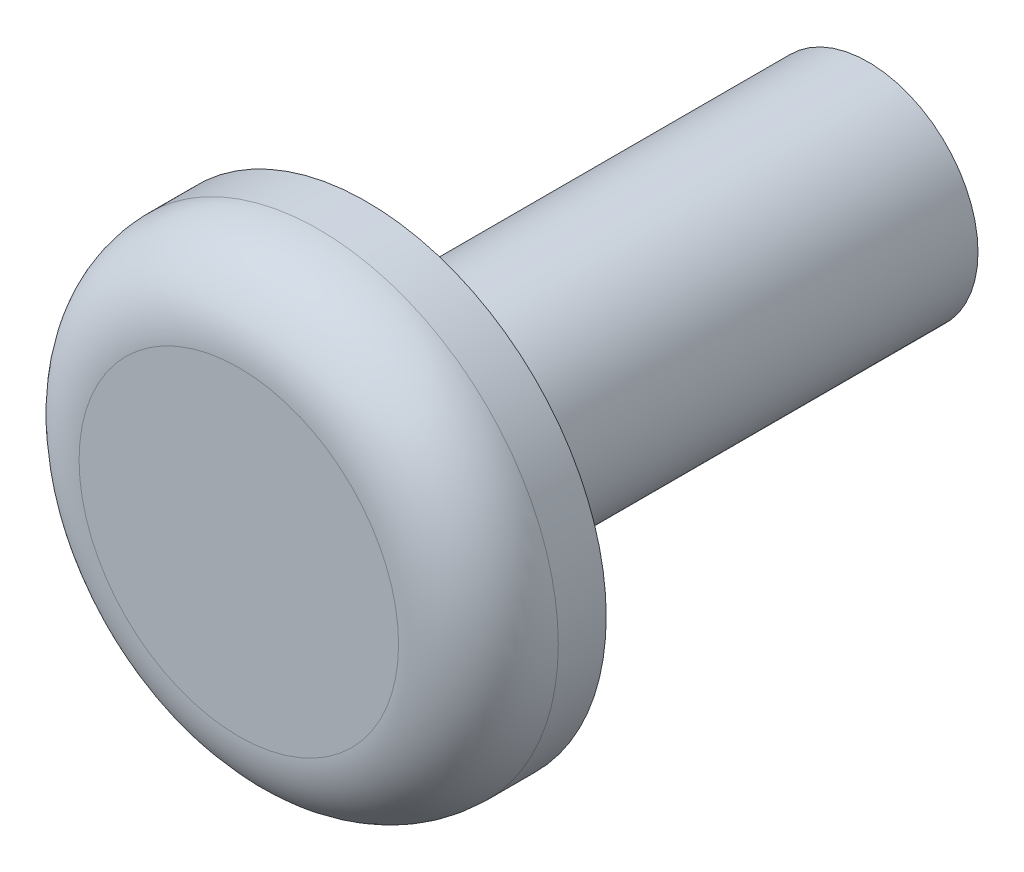
ISO-10303-21;
HEADER;
FILE_DESCRIPTION(('STEP AP214'),'2;1');
FILE_NAME('part.step','',(''),(''),'','','');
FILE_SCHEMA(('AUTOMOTIVE_DESIGN { 1 0 10303 214 1 1 1 1 }'));
ENDSEC;
DATA;
#1=APPLICATION_CONTEXT('core data for automotive mechanical design processes');
#2=APPLICATION_PROTOCOL_DEFINITION('international standard','automotive_design',2000,#1);
#3=PRODUCT_CONTEXT('',#1,'mechanical');
#4=PRODUCT('Part','Part','',(#3));
#5=PRODUCT_RELATED_PRODUCT_CATEGORY('part','',(#4));
#6=PRODUCT_DEFINITION_FORMATION('','',#4);
#7=PRODUCT_DEFINITION_CONTEXT('part definition',#1,'design');
#8=PRODUCT_DEFINITION('design','',#6,#7);
#9=PRODUCT_DEFINITION_SHAPE('','',#8);
#10=(LENGTH_UNIT() NAMED_UNIT(*) SI_UNIT(.MILLI.,.METRE.));
#11=(NAMED_UNIT(*) PLANE_ANGLE_UNIT() SI_UNIT($,.RADIAN.));
#12=(NAMED_UNIT(*) SI_UNIT($,.STERADIAN.) SOLID_ANGLE_UNIT());
#13=UNCERTAINTY_MEASURE_WITH_UNIT(LENGTH_MEASURE(1.E-05),#10,'distance_accuracy_value','');
#14=(GEOMETRIC_REPRESENTATION_CONTEXT(3) GLOBAL_UNCERTAINTY_ASSIGNED_CONTEXT((#13)) GLOBAL_UNIT_ASSIGNED_CONTEXT((#10,
#11,#12)) REPRESENTATION_CONTEXT('',''));
#15=CARTESIAN_POINT('',(0.,0.,0.));
#16=DIRECTION('',(0.,0.,1.));
#17=DIRECTION('',(1.,0.,0.));
#18=AXIS2_PLACEMENT_3D('',#15,#16,#17);
#19=CARTESIAN_POINT('',(0.,0.,15.7));
#20=DIRECTION('',(0.,0.,-1.));
#21=DIRECTION('',(-1.,0.,0.));
#22=AXIS2_PLACEMENT_3D('',#19,#20,#21);
#23=CYLINDRICAL_SURFACE('',#22,3.4375);
#24=CARTESIAN_POINT('',(0.,0.,15.7));
#25=DIRECTION('',(0.,0.,1.));
#26=DIRECTION('',(1.,0.,0.));
#27=AXIS2_PLACEMENT_3D('',#24,#25,#26);
#28=CIRCLE('',#27,3.4375);
#29=CARTESIAN_POINT('',(3.4375,0.,15.7));
#30=VERTEX_POINT('',#29);
#31=EDGE_CURVE('E69',#30,#30,#28,.T.);
#32=ORIENTED_EDGE('',*,*,#31,.F.);
#33=EDGE_LOOP('',(#32));
#34=FACE_BOUND('',#33,.T.);
#35=CARTESIAN_POINT('',(0.,0.,0.));
#36=DIRECTION('',(0.,0.,1.));
#37=DIRECTION('',(1.,0.,0.));
#38=AXIS2_PLACEMENT_3D('',#35,#36,#37);
#39=CIRCLE('',#38,3.4375);
#40=CARTESIAN_POINT('',(3.4375,0.,0.));
#41=VERTEX_POINT('',#40);
#42=EDGE_CURVE('E70',#41,#41,#39,.T.);
#43=ORIENTED_EDGE('',*,*,#42,.T.);
#44=EDGE_LOOP('',(#43));
#45=FACE_BOUND('',#44,.T.);
#46=ADVANCED_FACE('F45',(#34,#45),#23,.T.);
#47=CARTESIAN_POINT('',(0.,0.,0.));
#48=DIRECTION('',(0.,0.,1.));
#49=DIRECTION('',(1.,0.,0.));
#50=AXIS2_PLACEMENT_3D('',#47,#48,#49);
#51=PLANE('',#50);
#52=CARTESIAN_POINT('',(0.,0.,0.));
#53=DIRECTION('',(0.,0.,1.));
#54=DIRECTION('',(1.,0.,0.));
#55=AXIS2_PLACEMENT_3D('',#52,#53,#54);
#56=CIRCLE('',#55,1.7);
#57=CARTESIAN_POINT('',(1.7,0.,0.));
#58=VERTEX_POINT('',#57);
#59=EDGE_CURVE('E58',#58,#58,#56,.T.);
#60=ORIENTED_EDGE('',*,*,#59,.T.);
#61=EDGE_LOOP('',(#60));
#62=FACE_BOUND('',#61,.T.);
#63=ORIENTED_EDGE('',*,*,#42,.F.);
#64=EDGE_LOOP('',(#63));
#65=FACE_BOUND('',#64,.T.);
#66=ADVANCED_FACE('F106',(#62,#65),#51,.F.);
#67=CARTESIAN_POINT('',(0.,0.,19.7));
#68=DIRECTION('',(0.,0.,-1.));
#69=DIRECTION('',(-1.,0.,0.));
#70=AXIS2_PLACEMENT_3D('',#67,#68,#69);
#71=CYLINDRICAL_SURFACE('',#70,7.5);
#72=CARTESIAN_POINT('',(0.,0.,17.2));
#73=DIRECTION('',(0.,0.,1.));
#74=DIRECTION('',(1.,0.,0.));
#75=AXIS2_PLACEMENT_3D('',#72,#73,#74);
#76=CIRCLE('',#75,7.5);
#77=CARTESIAN_POINT('',(7.5,0.,17.2));
#78=VERTEX_POINT('',#77);
#79=EDGE_CURVE('E10',#78,#78,#76,.F.);
#80=ORIENTED_EDGE('',*,*,#79,.T.);
#81=EDGE_LOOP('',(#80));
#82=FACE_BOUND('',#81,.T.);
#83=CARTESIAN_POINT('',(0.,0.,15.7));
#84=DIRECTION('',(0.,0.,1.));
#85=DIRECTION('',(1.,0.,0.));
#86=AXIS2_PLACEMENT_3D('',#83,#84,#85);
#87=CIRCLE('',#86,7.5);
#88=CARTESIAN_POINT('',(7.5,0.,15.7));
#89=VERTEX_POINT('',#88);
#90=EDGE_CURVE('E74',#89,#89,#87,.T.);
#91=ORIENTED_EDGE('',*,*,#90,.T.);
#92=EDGE_LOOP('',(#91));
#93=FACE_BOUND('',#92,.T.);
#94=ADVANCED_FACE('F111',(#82,#93),#71,.T.);
#95=CARTESIAN_POINT('',(0.,0.,19.7));
#96=DIRECTION('',(0.,0.,1.));
#97=DIRECTION('',(1.,0.,0.));
#98=AXIS2_PLACEMENT_3D('',#95,#96,#97);
#99=PLANE('',#98);
#100=CARTESIAN_POINT('',(0.,0.,19.7));
#101=DIRECTION('',(0.,0.,1.));
#102=DIRECTION('',(1.,0.,0.));
#103=AXIS2_PLACEMENT_3D('',#100,#101,#102);
#104=CIRCLE('',#103,5.);
#105=CARTESIAN_POINT('',(5.,0.,19.7));
#106=VERTEX_POINT('',#105);
#107=EDGE_CURVE('E53',#106,#106,#104,.T.);
#108=ORIENTED_EDGE('',*,*,#107,.T.);
#109=EDGE_LOOP('',(#108));
#110=FACE_BOUND('',#109,.T.);
#111=ADVANCED_FACE('F101',(#110),#99,.T.);
#112=CARTESIAN_POINT('',(0.,0.,15.7));
#113=DIRECTION('',(0.,0.,1.));
#114=DIRECTION('',(1.,0.,0.));
#115=AXIS2_PLACEMENT_3D('',#112,#113,#114);
#116=PLANE('',#115);
#117=ORIENTED_EDGE('',*,*,#31,.T.);
#118=EDGE_LOOP('',(#117));
#119=FACE_BOUND('',#118,.T.);
#120=ORIENTED_EDGE('',*,*,#90,.F.);
#121=EDGE_LOOP('',(#120));
#122=FACE_BOUND('',#121,.T.);
#123=ADVANCED_FACE('F90',(#119,#122),#116,.F.);
#124=CARTESIAN_POINT('',(0.,0.,5.));
#125=DIRECTION('',(0.,0.,-1.));
#126=DIRECTION('',(-1.,0.,0.));
#127=AXIS2_PLACEMENT_3D('',#124,#125,#126);
#128=CYLINDRICAL_SURFACE('',#127,1.5);
#129=CARTESIAN_POINT('',(0.,0.,1.00000000000001));
#130=DIRECTION('',(0.,0.,1.));
#131=DIRECTION('',(1.,0.,0.));
#132=AXIS2_PLACEMENT_3D('',#129,#130,#131);
#133=CIRCLE('',#132,1.5);
#134=CARTESIAN_POINT('',(1.5,0.,1.00000000000001));
#135=VERTEX_POINT('',#134);
#136=EDGE_CURVE('E63',#135,#135,#133,.F.);
#137=ORIENTED_EDGE('',*,*,#136,.T.);
#138=EDGE_LOOP('',(#137));
#139=FACE_BOUND('',#138,.T.);
#140=CARTESIAN_POINT('',(0.,0.,5.));
#141=DIRECTION('',(0.,0.,-1.));
#142=DIRECTION('',(-1.,0.,0.));
#143=AXIS2_PLACEMENT_3D('',#140,#141,#142);
#144=CIRCLE('',#143,1.5);
#145=CARTESIAN_POINT('',(-1.5,0.,5.));
#146=VERTEX_POINT('',#145);
#147=EDGE_CURVE('E81',#146,#146,#144,.T.);
#148=ORIENTED_EDGE('',*,*,#147,.F.);
#149=EDGE_LOOP('',(#148));
#150=FACE_BOUND('',#149,.T.);
#151=ADVANCED_FACE('F88',(#139,#150),#128,.F.);
#152=CARTESIAN_POINT('',(0.,0.,5.));
#153=DIRECTION('',(0.,0.,-1.));
#154=DIRECTION('',(-1.,0.,0.));
#155=AXIS2_PLACEMENT_3D('',#152,#153,#154);
#156=PLANE('',#155);
#157=ORIENTED_EDGE('',*,*,#147,.T.);
#158=EDGE_LOOP('',(#157));
#159=FACE_BOUND('',#158,.T.);
#160=ADVANCED_FACE('F86',(#159),#156,.T.);
#161=CARTESIAN_POINT('',(0.,0.,1.00000000000001));
#162=DIRECTION('',(0.,0.,-1.));
#163=DIRECTION('',(-1.,0.,0.));
#164=AXIS2_PLACEMENT_3D('',#161,#162,#163);
#165=CONICAL_SURFACE('',#164,1.5,0.197395559849877);
#166=ORIENTED_EDGE('',*,*,#59,.F.);
#167=EDGE_LOOP('',(#166));
#168=FACE_BOUND('',#167,.T.);
#169=ORIENTED_EDGE('',*,*,#136,.F.);
#170=EDGE_LOOP('',(#169));
#171=FACE_BOUND('',#170,.T.);
#172=ADVANCED_FACE('F98',(#168,#171),#165,.F.);
#173=CARTESIAN_POINT('',(0.,0.,17.2));
#174=DIRECTION('',(0.,0.,1.));
#175=DIRECTION('',(1.,0.,0.));
#176=AXIS2_PLACEMENT_3D('',#173,#174,#175);
#177=TOROIDAL_SURFACE('',#176,5.,2.5);
#178=ORIENTED_EDGE('',*,*,#79,.F.);
#179=EDGE_LOOP('',(#178));
#180=FACE_BOUND('',#179,.T.);
#181=ORIENTED_EDGE('',*,*,#107,.F.);
#182=EDGE_LOOP('',(#181));
#183=FACE_BOUND('',#182,.T.);
#184=ADVANCED_FACE('F47',(#180,#183),#177,.T.);
#185=CLOSED_SHELL('',(#46,#66,#94,#111,#123,#151,#160,#172,#184));
#186=MANIFOLD_SOLID_BREP('B2',#185);
#187=ADVANCED_BREP_SHAPE_REPRESENTATION('',(#18,#186),#14);
#188=SHAPE_DEFINITION_REPRESENTATION(#9,#187);
ENDSEC;
END-ISO-10303-21;
